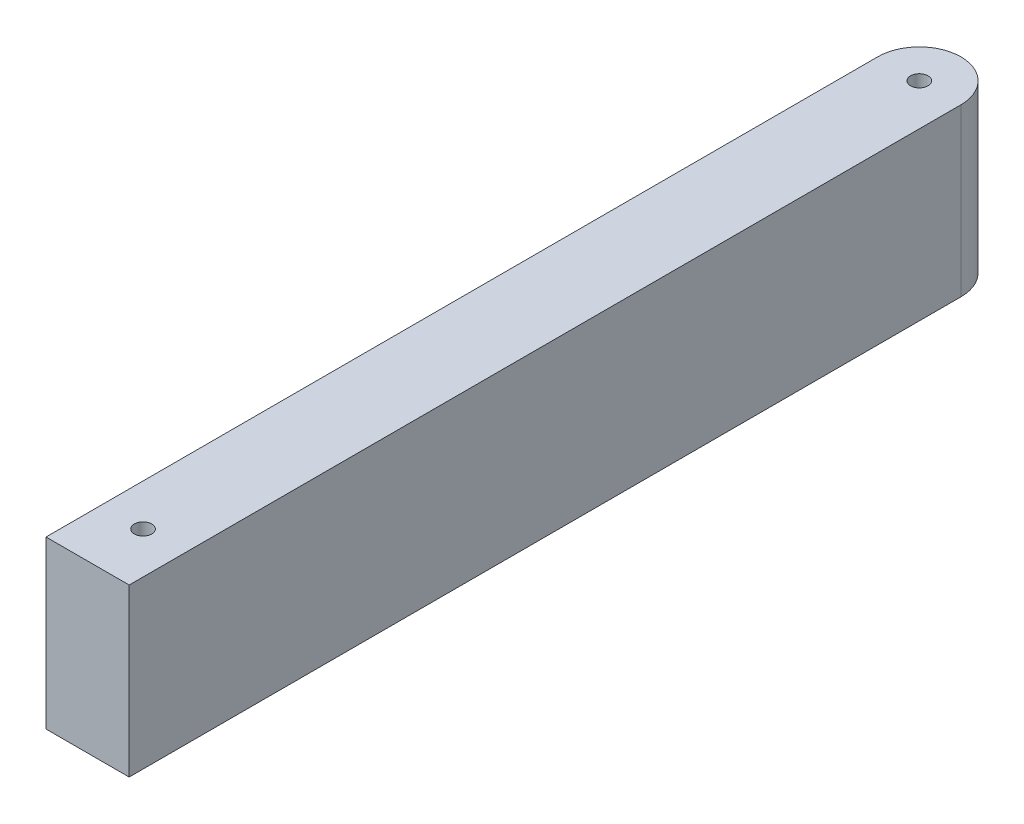
ISO-10303-21;
HEADER;
FILE_DESCRIPTION(('STEP AP214'),'2;1');
FILE_NAME('part.step','',(''),(''),'','','');
FILE_SCHEMA(('AUTOMOTIVE_DESIGN { 1 0 10303 214 1 1 1 1 }'));
ENDSEC;
DATA;
#1=APPLICATION_CONTEXT('core data for automotive mechanical design processes');
#2=APPLICATION_PROTOCOL_DEFINITION('international standard','automotive_design',2000,#1);
#3=PRODUCT_CONTEXT('',#1,'mechanical');
#4=PRODUCT('Part','Part','',(#3));
#5=PRODUCT_RELATED_PRODUCT_CATEGORY('part','',(#4));
#6=PRODUCT_DEFINITION_FORMATION('','',#4);
#7=PRODUCT_DEFINITION_CONTEXT('part definition',#1,'design');
#8=PRODUCT_DEFINITION('design','',#6,#7);
#9=PRODUCT_DEFINITION_SHAPE('','',#8);
#10=(LENGTH_UNIT() NAMED_UNIT(*) SI_UNIT(.MILLI.,.METRE.));
#11=(NAMED_UNIT(*) PLANE_ANGLE_UNIT() SI_UNIT($,.RADIAN.));
#12=(NAMED_UNIT(*) SI_UNIT($,.STERADIAN.) SOLID_ANGLE_UNIT());
#13=UNCERTAINTY_MEASURE_WITH_UNIT(LENGTH_MEASURE(1.E-05),#10,'distance_accuracy_value','');
#14=(GEOMETRIC_REPRESENTATION_CONTEXT(3) GLOBAL_UNCERTAINTY_ASSIGNED_CONTEXT((#13)) GLOBAL_UNIT_ASSIGNED_CONTEXT((#10,
#11,#12)) REPRESENTATION_CONTEXT('',''));
#15=CARTESIAN_POINT('',(0.,0.,0.));
#16=DIRECTION('',(0.,0.,1.));
#17=DIRECTION('',(1.,0.,0.));
#18=AXIS2_PLACEMENT_3D('',#15,#16,#17);
#19=CARTESIAN_POINT('',(19.05,0.,0.));
#20=DIRECTION('',(0.,1.,0.));
#21=DIRECTION('',(-1.,0.,0.));
#22=AXIS2_PLACEMENT_3D('',#19,#20,#21);
#23=CYLINDRICAL_SURFACE('',#22,19.05);
#24=CARTESIAN_POINT('',(19.05,0.,0.));
#25=DIRECTION('',(0.,1.,0.));
#26=DIRECTION('',(-1.,0.,0.));
#27=AXIS2_PLACEMENT_3D('',#24,#25,#26);
#28=CIRCLE('',#27,19.05);
#29=CARTESIAN_POINT('',(38.1,0.,1.33025439009923E-13));
#30=VERTEX_POINT('',#29);
#31=CARTESIAN_POINT('',(0.,0.,0.));
#32=VERTEX_POINT('',#31);
#33=EDGE_CURVE('E11',#30,#32,#28,.T.);
#34=ORIENTED_EDGE('',*,*,#33,.F.);
#35=DIRECTION('',(0.,-1.,0.));
#36=VECTOR('',#35,1.);
#37=CARTESIAN_POINT('',(38.1,-76.2,1.33025439009923E-13));
#38=LINE('',#37,#36);
#39=CARTESIAN_POINT('',(38.1,-76.2,0.));
#40=VERTEX_POINT('',#39);
#41=EDGE_CURVE('E103',#30,#40,#38,.T.);
#42=ORIENTED_EDGE('',*,*,#41,.T.);
#43=CARTESIAN_POINT('',(19.05,-76.2,0.));
#44=DIRECTION('',(0.,1.,0.));
#45=DIRECTION('',(-1.,0.,0.));
#46=AXIS2_PLACEMENT_3D('',#43,#44,#45);
#47=CIRCLE('',#46,19.05);
#48=CARTESIAN_POINT('',(0.,-76.2,0.));
#49=VERTEX_POINT('',#48);
#50=EDGE_CURVE('E41',#40,#49,#47,.T.);
#51=ORIENTED_EDGE('',*,*,#50,.T.);
#52=DIRECTION('',(0.,-1.,0.));
#53=VECTOR('',#52,1.);
#54=CARTESIAN_POINT('',(0.,-76.2,0.));
#55=LINE('',#54,#53);
#56=EDGE_CURVE('E101',#32,#49,#55,.T.);
#57=ORIENTED_EDGE('',*,*,#56,.F.);
#58=EDGE_LOOP('',(#34,#42,#51,#57));
#59=FACE_BOUND('',#58,.T.);
#60=ADVANCED_FACE('F33',(#59),#23,.T.);
#61=CARTESIAN_POINT('',(38.1,0.,1.33025439009923E-13));
#62=DIRECTION('',(0.,1.,0.));
#63=DIRECTION('',(-1.,0.,0.));
#64=AXIS2_PLACEMENT_3D('',#61,#62,#63);
#65=PLANE('',#64);
#66=CARTESIAN_POINT('',(19.05,0.,355.6));
#67=DIRECTION('',(0.,1.,0.));
#68=DIRECTION('',(-1.,0.,0.));
#69=AXIS2_PLACEMENT_3D('',#66,#67,#68);
#70=CIRCLE('',#69,3.98779999999999);
#71=CARTESIAN_POINT('',(15.0622,0.,355.6));
#72=VERTEX_POINT('',#71);
#73=EDGE_CURVE('E116',#72,#72,#70,.T.);
#74=ORIENTED_EDGE('',*,*,#73,.F.);
#75=EDGE_LOOP('',(#74));
#76=FACE_BOUND('',#75,.T.);
#77=CARTESIAN_POINT('',(19.05,0.,0.));
#78=DIRECTION('',(0.,1.,0.));
#79=DIRECTION('',(-1.,0.,0.));
#80=AXIS2_PLACEMENT_3D('',#77,#78,#79);
#81=CIRCLE('',#80,3.9878);
#82=CARTESIAN_POINT('',(15.0622,0.,0.));
#83=VERTEX_POINT('',#82);
#84=EDGE_CURVE('E110',#83,#83,#81,.T.);
#85=ORIENTED_EDGE('',*,*,#84,.F.);
#86=EDGE_LOOP('',(#85));
#87=FACE_BOUND('',#86,.T.);
#88=ORIENTED_EDGE('',*,*,#33,.T.);
#89=DIRECTION('',(0.,0.,-1.));
#90=VECTOR('',#89,1.);
#91=CARTESIAN_POINT('',(0.,0.,381.));
#92=LINE('',#91,#90);
#93=CARTESIAN_POINT('',(0.,0.,381.));
#94=VERTEX_POINT('',#93);
#95=EDGE_CURVE('E72',#94,#32,#92,.T.);
#96=ORIENTED_EDGE('',*,*,#95,.F.);
#97=DIRECTION('',(-1.,0.,0.));
#98=VECTOR('',#97,1.);
#99=CARTESIAN_POINT('',(0.,0.,381.));
#100=LINE('',#99,#98);
#101=CARTESIAN_POINT('',(38.1,0.,381.));
#102=VERTEX_POINT('',#101);
#103=EDGE_CURVE('E55',#102,#94,#100,.T.);
#104=ORIENTED_EDGE('',*,*,#103,.F.);
#105=DIRECTION('',(0.,0.,-1.));
#106=VECTOR('',#105,1.);
#107=CARTESIAN_POINT('',(38.1,0.,381.));
#108=LINE('',#107,#106);
#109=EDGE_CURVE('E47',#102,#30,#108,.T.);
#110=ORIENTED_EDGE('',*,*,#109,.T.);
#111=EDGE_LOOP('',(#88,#96,#104,#110));
#112=FACE_BOUND('',#111,.T.);
#113=ADVANCED_FACE('F35',(#76,#87,#112),#65,.T.);
#114=CARTESIAN_POINT('',(19.05,-76.2,0.));
#115=DIRECTION('',(0.,-1.,0.));
#116=DIRECTION('',(1.,0.,0.));
#117=AXIS2_PLACEMENT_3D('',#114,#115,#116);
#118=PLANE('',#117);
#119=CARTESIAN_POINT('',(19.05,-76.2,355.6));
#120=DIRECTION('',(0.,1.,0.));
#121=DIRECTION('',(-1.,0.,0.));
#122=AXIS2_PLACEMENT_3D('',#119,#120,#121);
#123=CIRCLE('',#122,3.98779999999999);
#124=CARTESIAN_POINT('',(15.0622,-76.2,355.6));
#125=VERTEX_POINT('',#124);
#126=EDGE_CURVE('E114',#125,#125,#123,.T.);
#127=ORIENTED_EDGE('',*,*,#126,.T.);
#128=EDGE_LOOP('',(#127));
#129=FACE_BOUND('',#128,.T.);
#130=CARTESIAN_POINT('',(19.05,-76.2,0.));
#131=DIRECTION('',(0.,1.,0.));
#132=DIRECTION('',(-1.,0.,0.));
#133=AXIS2_PLACEMENT_3D('',#130,#131,#132);
#134=CIRCLE('',#133,3.9878);
#135=CARTESIAN_POINT('',(15.0622,-76.2,0.));
#136=VERTEX_POINT('',#135);
#137=EDGE_CURVE('E108',#136,#136,#134,.T.);
#138=ORIENTED_EDGE('',*,*,#137,.T.);
#139=EDGE_LOOP('',(#138));
#140=FACE_BOUND('',#139,.T.);
#141=ORIENTED_EDGE('',*,*,#50,.F.);
#142=DIRECTION('',(0.,0.,-1.));
#143=VECTOR('',#142,1.);
#144=CARTESIAN_POINT('',(38.1,-76.2,381.));
#145=LINE('',#144,#143);
#146=CARTESIAN_POINT('',(38.1,-76.2,381.));
#147=VERTEX_POINT('',#146);
#148=EDGE_CURVE('E86',#147,#40,#145,.T.);
#149=ORIENTED_EDGE('',*,*,#148,.F.);
#150=DIRECTION('',(1.,0.,0.));
#151=VECTOR('',#150,1.);
#152=CARTESIAN_POINT('',(0.,-76.2,381.));
#153=LINE('',#152,#151);
#154=CARTESIAN_POINT('',(0.,-76.2,381.));
#155=VERTEX_POINT('',#154);
#156=EDGE_CURVE('E78',#155,#147,#153,.T.);
#157=ORIENTED_EDGE('',*,*,#156,.F.);
#158=DIRECTION('',(0.,0.,-1.));
#159=VECTOR('',#158,1.);
#160=CARTESIAN_POINT('',(0.,-76.2,381.));
#161=LINE('',#160,#159);
#162=EDGE_CURVE('E91',#155,#49,#161,.T.);
#163=ORIENTED_EDGE('',*,*,#162,.T.);
#164=EDGE_LOOP('',(#141,#149,#157,#163));
#165=FACE_BOUND('',#164,.T.);
#166=ADVANCED_FACE('F87',(#129,#140,#165),#118,.T.);
#167=CARTESIAN_POINT('',(0.,0.,381.));
#168=DIRECTION('',(1.,0.,0.));
#169=DIRECTION('',(0.,0.,-1.));
#170=AXIS2_PLACEMENT_3D('',#167,#168,#169);
#171=PLANE('',#170);
#172=ORIENTED_EDGE('',*,*,#56,.T.);
#173=ORIENTED_EDGE('',*,*,#162,.F.);
#174=DIRECTION('',(0.,-1.,0.));
#175=VECTOR('',#174,1.);
#176=CARTESIAN_POINT('',(0.,0.,381.));
#177=LINE('',#176,#175);
#178=EDGE_CURVE('E82',#94,#155,#177,.T.);
#179=ORIENTED_EDGE('',*,*,#178,.F.);
#180=ORIENTED_EDGE('',*,*,#95,.T.);
#181=EDGE_LOOP('',(#172,#173,#179,#180));
#182=FACE_BOUND('',#181,.T.);
#183=ADVANCED_FACE('F107',(#182),#171,.F.);
#184=CARTESIAN_POINT('',(38.1,0.,381.));
#185=DIRECTION('',(-1.,0.,0.));
#186=DIRECTION('',(0.,0.,1.));
#187=AXIS2_PLACEMENT_3D('',#184,#185,#186);
#188=PLANE('',#187);
#189=ORIENTED_EDGE('',*,*,#41,.F.);
#190=ORIENTED_EDGE('',*,*,#109,.F.);
#191=DIRECTION('',(0.,1.,0.));
#192=VECTOR('',#191,1.);
#193=CARTESIAN_POINT('',(38.1,0.,381.));
#194=LINE('',#193,#192);
#195=EDGE_CURVE('E81',#147,#102,#194,.T.);
#196=ORIENTED_EDGE('',*,*,#195,.F.);
#197=ORIENTED_EDGE('',*,*,#148,.T.);
#198=EDGE_LOOP('',(#189,#190,#196,#197));
#199=FACE_BOUND('',#198,.T.);
#200=ADVANCED_FACE('F93',(#199),#188,.F.);
#201=CARTESIAN_POINT('',(0.,0.,381.));
#202=DIRECTION('',(0.,0.,1.));
#203=DIRECTION('',(1.,0.,0.));
#204=AXIS2_PLACEMENT_3D('',#201,#202,#203);
#205=PLANE('',#204);
#206=ORIENTED_EDGE('',*,*,#178,.T.);
#207=ORIENTED_EDGE('',*,*,#156,.T.);
#208=ORIENTED_EDGE('',*,*,#195,.T.);
#209=ORIENTED_EDGE('',*,*,#103,.T.);
#210=EDGE_LOOP('',(#206,#207,#208,#209));
#211=FACE_BOUND('',#210,.T.);
#212=ADVANCED_FACE('F79',(#211),#205,.T.);
#213=CARTESIAN_POINT('',(19.05,-76.2,0.));
#214=DIRECTION('',(0.,1.,0.));
#215=DIRECTION('',(-1.,0.,0.));
#216=AXIS2_PLACEMENT_3D('',#213,#214,#215);
#217=CYLINDRICAL_SURFACE('',#216,3.9878);
#218=CARTESIAN_POINT('',(15.0622,-76.2,0.));
#219=CARTESIAN_POINT('',(15.0622,-75.40625,0.));
#220=CARTESIAN_POINT('',(15.0622,-74.6125,0.));
#221=CARTESIAN_POINT('',(15.0622,-73.025,0.));
#222=CARTESIAN_POINT('',(15.0622,-72.23125,0.));
#223=CARTESIAN_POINT('',(15.0622,-70.64375,0.));
#224=CARTESIAN_POINT('',(15.0622,-69.85,0.));
#225=CARTESIAN_POINT('',(15.0622,-68.2625,0.));
#226=CARTESIAN_POINT('',(15.0622,-67.46875,0.));
#227=CARTESIAN_POINT('',(15.0622,-65.88125,0.));
#228=CARTESIAN_POINT('',(15.0622,-65.0875,0.));
#229=CARTESIAN_POINT('',(15.0622,-63.5,0.));
#230=CARTESIAN_POINT('',(15.0622,-62.70625,0.));
#231=CARTESIAN_POINT('',(15.0622,-61.11875,0.));
#232=CARTESIAN_POINT('',(15.0622,-60.325,0.));
#233=CARTESIAN_POINT('',(15.0622,-58.7375,0.));
#234=CARTESIAN_POINT('',(15.0622,-57.94375,0.));
#235=CARTESIAN_POINT('',(15.0622,-56.35625,0.));
#236=CARTESIAN_POINT('',(15.0622,-55.5625,0.));
#237=CARTESIAN_POINT('',(15.0622,-53.975,0.));
#238=CARTESIAN_POINT('',(15.0622,-53.18125,0.));
#239=CARTESIAN_POINT('',(15.0622,-51.59375,0.));
#240=CARTESIAN_POINT('',(15.0622,-50.8,0.));
#241=CARTESIAN_POINT('',(15.0622,-49.2125,0.));
#242=CARTESIAN_POINT('',(15.0622,-48.41875,0.));
#243=CARTESIAN_POINT('',(15.0622,-46.83125,0.));
#244=CARTESIAN_POINT('',(15.0622,-46.0375,0.));
#245=CARTESIAN_POINT('',(15.0622,-44.45,0.));
#246=CARTESIAN_POINT('',(15.0622,-43.65625,0.));
#247=CARTESIAN_POINT('',(15.0622,-42.06875,0.));
#248=CARTESIAN_POINT('',(15.0622,-41.275,0.));
#249=CARTESIAN_POINT('',(15.0622,-39.6875,0.));
#250=CARTESIAN_POINT('',(15.0622,-38.89375,0.));
#251=CARTESIAN_POINT('',(15.0622,-37.30625,0.));
#252=CARTESIAN_POINT('',(15.0622,-36.5125,0.));
#253=CARTESIAN_POINT('',(15.0622,-34.925,0.));
#254=CARTESIAN_POINT('',(15.0622,-34.13125,0.));
#255=CARTESIAN_POINT('',(15.0622,-32.54375,0.));
#256=CARTESIAN_POINT('',(15.0622,-31.75,0.));
#257=CARTESIAN_POINT('',(15.0622,-30.1625,0.));
#258=CARTESIAN_POINT('',(15.0622,-29.36875,0.));
#259=CARTESIAN_POINT('',(15.0622,-27.78125,0.));
#260=CARTESIAN_POINT('',(15.0622,-26.9875,0.));
#261=CARTESIAN_POINT('',(15.0622,-25.4,0.));
#262=CARTESIAN_POINT('',(15.0622,-24.60625,0.));
#263=CARTESIAN_POINT('',(15.0622,-23.01875,0.));
#264=CARTESIAN_POINT('',(15.0622,-22.225,0.));
#265=CARTESIAN_POINT('',(15.0622,-20.6375,0.));
#266=CARTESIAN_POINT('',(15.0622,-19.84375,0.));
#267=CARTESIAN_POINT('',(15.0622,-18.25625,0.));
#268=CARTESIAN_POINT('',(15.0622,-17.4625,0.));
#269=CARTESIAN_POINT('',(15.0622,-15.875,0.));
#270=CARTESIAN_POINT('',(15.0622,-15.08125,0.));
#271=CARTESIAN_POINT('',(15.0622,-13.49375,0.));
#272=CARTESIAN_POINT('',(15.0622,-12.7,0.));
#273=CARTESIAN_POINT('',(15.0622,-11.1125,0.));
#274=CARTESIAN_POINT('',(15.0622,-10.31875,0.));
#275=CARTESIAN_POINT('',(15.0622,-8.73125,0.));
#276=CARTESIAN_POINT('',(15.0622,-7.93750000000001,0.));
#277=CARTESIAN_POINT('',(15.0622,-6.35,0.));
#278=CARTESIAN_POINT('',(15.0622,-5.55625,0.));
#279=CARTESIAN_POINT('',(15.0622,-3.96875,0.));
#280=CARTESIAN_POINT('',(15.0622,-3.175,0.));
#281=CARTESIAN_POINT('',(15.0622,-1.5875,0.));
#282=CARTESIAN_POINT('',(15.0622,-0.793750000000001,0.));
#283=CARTESIAN_POINT('',(15.0622,0.,0.));
#284=B_SPLINE_CURVE_WITH_KNOTS('',3,(#218,#219,#220,#221,#222,#223,#224,#225,#226,#227,#228,
#229,#230,#231,#232,#233,#234,#235,#236,#237,#238,#239,#240,#241,#242,#243,#244,#245,#246,#247,
#248,#249,#250,#251,#252,#253,#254,#255,#256,#257,#258,#259,#260,#261,#262,#263,#264,#265,#266,
#267,#268,#269,#270,#271,#272,#273,#274,#275,#276,#277,#278,#279,#280,#281,#282,#283),
.UNSPECIFIED.,.F.,.F.,(4,2,2,2,2,2,2,2,2,2,2,2,2,2,2,2,2,2,2,2,2,2,2,2,2,2,2,2,2,2,2,2,4),(0.,
2.38125,4.7625,7.14375,9.52500000000001,11.90625,14.2875,16.66875,19.05,21.43125,23.8125,
26.19375,28.575,30.95625,33.3375,35.71875,38.1,40.48125,42.8625,45.24375,47.625,50.00625,
52.3875,54.76875,57.15,59.53125,61.9125,64.29375,66.675,69.05625,71.4375,73.81875,76.2),.UNSPECIFIED.);
#285=EDGE_CURVE('BSEAM127',#136,#83,#284,.T.);
#286=ORIENTED_EDGE('',*,*,#137,.F.);
#287=ORIENTED_EDGE('',*,*,#84,.T.);
#288=ORIENTED_EDGE('',*,*,#285,.T.);
#289=ORIENTED_EDGE('',*,*,#285,.F.);
#290=EDGE_LOOP('',(#286,#288,#287,#289));
#291=FACE_BOUND('',#290,.T.);
#292=ADVANCED_FACE('F127',(#291),#217,.F.);
#293=CARTESIAN_POINT('',(19.05,-76.2,355.6));
#294=DIRECTION('',(0.,1.,0.));
#295=DIRECTION('',(-1.,0.,0.));
#296=AXIS2_PLACEMENT_3D('',#293,#294,#295);
#297=CYLINDRICAL_SURFACE('',#296,3.98779999999999);
#298=CARTESIAN_POINT('',(15.0622,-76.2,355.6));
#299=CARTESIAN_POINT('',(15.0622,-75.40625,355.6));
#300=CARTESIAN_POINT('',(15.0622,-74.6125,355.6));
#301=CARTESIAN_POINT('',(15.0622,-73.025,355.6));
#302=CARTESIAN_POINT('',(15.0622,-72.23125,355.6));
#303=CARTESIAN_POINT('',(15.0622,-70.64375,355.6));
#304=CARTESIAN_POINT('',(15.0622,-69.85,355.6));
#305=CARTESIAN_POINT('',(15.0622,-68.2625,355.6));
#306=CARTESIAN_POINT('',(15.0622,-67.46875,355.6));
#307=CARTESIAN_POINT('',(15.0622,-65.88125,355.6));
#308=CARTESIAN_POINT('',(15.0622,-65.0875,355.6));
#309=CARTESIAN_POINT('',(15.0622,-63.5,355.6));
#310=CARTESIAN_POINT('',(15.0622,-62.70625,355.6));
#311=CARTESIAN_POINT('',(15.0622,-61.11875,355.6));
#312=CARTESIAN_POINT('',(15.0622,-60.325,355.6));
#313=CARTESIAN_POINT('',(15.0622,-58.7375,355.6));
#314=CARTESIAN_POINT('',(15.0622,-57.94375,355.6));
#315=CARTESIAN_POINT('',(15.0622,-56.35625,355.6));
#316=CARTESIAN_POINT('',(15.0622,-55.5625,355.6));
#317=CARTESIAN_POINT('',(15.0622,-53.975,355.6));
#318=CARTESIAN_POINT('',(15.0622,-53.18125,355.6));
#319=CARTESIAN_POINT('',(15.0622,-51.59375,355.6));
#320=CARTESIAN_POINT('',(15.0622,-50.8,355.6));
#321=CARTESIAN_POINT('',(15.0622,-49.2125,355.6));
#322=CARTESIAN_POINT('',(15.0622,-48.41875,355.6));
#323=CARTESIAN_POINT('',(15.0622,-46.83125,355.6));
#324=CARTESIAN_POINT('',(15.0622,-46.0375,355.6));
#325=CARTESIAN_POINT('',(15.0622,-44.45,355.6));
#326=CARTESIAN_POINT('',(15.0622,-43.65625,355.6));
#327=CARTESIAN_POINT('',(15.0622,-42.06875,355.6));
#328=CARTESIAN_POINT('',(15.0622,-41.275,355.6));
#329=CARTESIAN_POINT('',(15.0622,-39.6875,355.6));
#330=CARTESIAN_POINT('',(15.0622,-38.89375,355.6));
#331=CARTESIAN_POINT('',(15.0622,-37.30625,355.6));
#332=CARTESIAN_POINT('',(15.0622,-36.5125,355.6));
#333=CARTESIAN_POINT('',(15.0622,-34.925,355.6));
#334=CARTESIAN_POINT('',(15.0622,-34.13125,355.6));
#335=CARTESIAN_POINT('',(15.0622,-32.54375,355.6));
#336=CARTESIAN_POINT('',(15.0622,-31.75,355.6));
#337=CARTESIAN_POINT('',(15.0622,-30.1625,355.6));
#338=CARTESIAN_POINT('',(15.0622,-29.36875,355.6));
#339=CARTESIAN_POINT('',(15.0622,-27.78125,355.6));
#340=CARTESIAN_POINT('',(15.0622,-26.9875,355.6));
#341=CARTESIAN_POINT('',(15.0622,-25.4,355.6));
#342=CARTESIAN_POINT('',(15.0622,-24.60625,355.6));
#343=CARTESIAN_POINT('',(15.0622,-23.01875,355.6));
#344=CARTESIAN_POINT('',(15.0622,-22.225,355.6));
#345=CARTESIAN_POINT('',(15.0622,-20.6375,355.6));
#346=CARTESIAN_POINT('',(15.0622,-19.84375,355.6));
#347=CARTESIAN_POINT('',(15.0622,-18.25625,355.6));
#348=CARTESIAN_POINT('',(15.0622,-17.4625,355.6));
#349=CARTESIAN_POINT('',(15.0622,-15.875,355.6));
#350=CARTESIAN_POINT('',(15.0622,-15.08125,355.6));
#351=CARTESIAN_POINT('',(15.0622,-13.49375,355.6));
#352=CARTESIAN_POINT('',(15.0622,-12.7,355.6));
#353=CARTESIAN_POINT('',(15.0622,-11.1125,355.6));
#354=CARTESIAN_POINT('',(15.0622,-10.31875,355.6));
#355=CARTESIAN_POINT('',(15.0622,-8.73125,355.6));
#356=CARTESIAN_POINT('',(15.0622,-7.93750000000001,355.6));
#357=CARTESIAN_POINT('',(15.0622,-6.35,355.6));
#358=CARTESIAN_POINT('',(15.0622,-5.55625,355.6));
#359=CARTESIAN_POINT('',(15.0622,-3.96875,355.6));
#360=CARTESIAN_POINT('',(15.0622,-3.175,355.6));
#361=CARTESIAN_POINT('',(15.0622,-1.5875,355.6));
#362=CARTESIAN_POINT('',(15.0622,-0.793750000000001,355.6));
#363=CARTESIAN_POINT('',(15.0622,0.,355.6));
#364=B_SPLINE_CURVE_WITH_KNOTS('',3,(#298,#299,#300,#301,#302,#303,#304,#305,#306,#307,#308,
#309,#310,#311,#312,#313,#314,#315,#316,#317,#318,#319,#320,#321,#322,#323,#324,#325,#326,#327,
#328,#329,#330,#331,#332,#333,#334,#335,#336,#337,#338,#339,#340,#341,#342,#343,#344,#345,#346,
#347,#348,#349,#350,#351,#352,#353,#354,#355,#356,#357,#358,#359,#360,#361,#362,#363),
.UNSPECIFIED.,.F.,.F.,(4,2,2,2,2,2,2,2,2,2,2,2,2,2,2,2,2,2,2,2,2,2,2,2,2,2,2,2,2,2,2,2,4),(0.,
2.38125,4.7625,7.14375,9.52500000000001,11.90625,14.2875,16.66875,19.05,21.43125,23.8125,
26.19375,28.575,30.95625,33.3375,35.71875,38.1,40.48125,42.8625,45.24375,47.625,50.00625,
52.3875,54.76875,57.15,59.53125,61.9125,64.29375,66.675,69.05625,71.4375,73.81875,76.2),.UNSPECIFIED.);
#365=EDGE_CURVE('BSEAM124',#125,#72,#364,.T.);
#366=ORIENTED_EDGE('',*,*,#126,.F.);
#367=ORIENTED_EDGE('',*,*,#73,.T.);
#368=ORIENTED_EDGE('',*,*,#365,.T.);
#369=ORIENTED_EDGE('',*,*,#365,.F.);
#370=EDGE_LOOP('',(#366,#368,#367,#369));
#371=FACE_BOUND('',#370,.T.);
#372=ADVANCED_FACE('F124',(#371),#297,.F.);
#373=CLOSED_SHELL('',(#60,#113,#166,#183,#200,#212,#292,#372));
#374=MANIFOLD_SOLID_BREP('B2',#373);
#375=ADVANCED_BREP_SHAPE_REPRESENTATION('',(#18,#374),#14);
#376=SHAPE_DEFINITION_REPRESENTATION(#9,#375);
ENDSEC;
END-ISO-10303-21;
